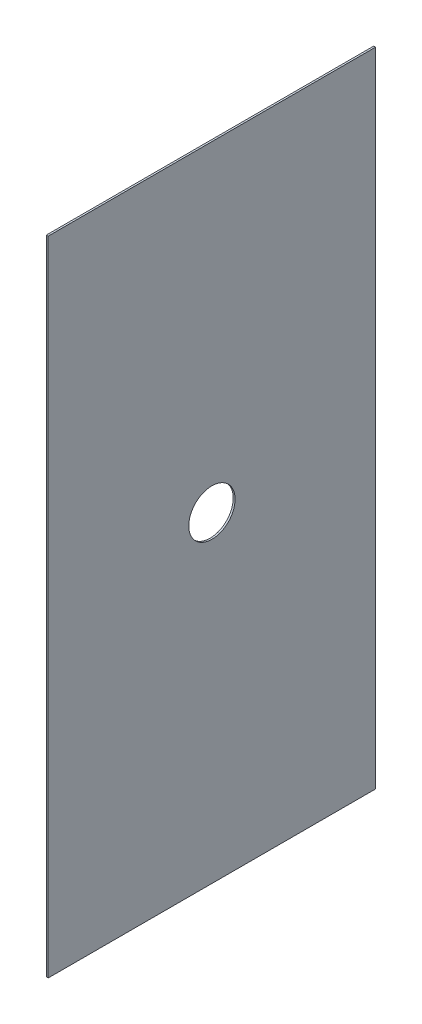
ISO-10303-21;
HEADER;
FILE_DESCRIPTION(('STEP AP214'),'2;1');
FILE_NAME('part.step','',(''),(''),'','','');
FILE_SCHEMA(('AUTOMOTIVE_DESIGN { 1 0 10303 214 1 1 1 1 }'));
ENDSEC;
DATA;
#1=APPLICATION_CONTEXT('core data for automotive mechanical design processes');
#2=APPLICATION_PROTOCOL_DEFINITION('international standard','automotive_design',2000,#1);
#3=PRODUCT_CONTEXT('',#1,'mechanical');
#4=PRODUCT('Part','Part','',(#3));
#5=PRODUCT_RELATED_PRODUCT_CATEGORY('part','',(#4));
#6=PRODUCT_DEFINITION_FORMATION('','',#4);
#7=PRODUCT_DEFINITION_CONTEXT('part definition',#1,'design');
#8=PRODUCT_DEFINITION('design','',#6,#7);
#9=PRODUCT_DEFINITION_SHAPE('','',#8);
#10=(LENGTH_UNIT() NAMED_UNIT(*) SI_UNIT(.MILLI.,.METRE.));
#11=(NAMED_UNIT(*) PLANE_ANGLE_UNIT() SI_UNIT($,.RADIAN.));
#12=(NAMED_UNIT(*) SI_UNIT($,.STERADIAN.) SOLID_ANGLE_UNIT());
#13=UNCERTAINTY_MEASURE_WITH_UNIT(LENGTH_MEASURE(1.E-05),#10,'distance_accuracy_value','');
#14=(GEOMETRIC_REPRESENTATION_CONTEXT(3) GLOBAL_UNCERTAINTY_ASSIGNED_CONTEXT((#13)) GLOBAL_UNIT_ASSIGNED_CONTEXT((#10,
#11,#12)) REPRESENTATION_CONTEXT('',''));
#15=CARTESIAN_POINT('',(0.,0.,0.));
#16=DIRECTION('',(0.,0.,1.));
#17=DIRECTION('',(1.,0.,0.));
#18=AXIS2_PLACEMENT_3D('',#15,#16,#17);
#19=CARTESIAN_POINT('',(3.,520.,265.));
#20=DIRECTION('',(0.,-1.,0.));
#21=DIRECTION('',(0.,0.,-1.));
#22=AXIS2_PLACEMENT_3D('',#19,#20,#21);
#23=PLANE('',#22);
#24=DIRECTION('',(0.,0.,1.));
#25=VECTOR('',#24,1.);
#26=CARTESIAN_POINT('',(0.,520.,265.));
#27=LINE('',#26,#25);
#28=CARTESIAN_POINT('',(0.,520.,-265.));
#29=VERTEX_POINT('',#28);
#30=CARTESIAN_POINT('',(0.,520.,265.));
#31=VERTEX_POINT('',#30);
#32=EDGE_CURVE('E97',#29,#31,#27,.T.);
#33=ORIENTED_EDGE('',*,*,#32,.T.);
#34=DIRECTION('',(-1.,0.,0.));
#35=VECTOR('',#34,1.);
#36=CARTESIAN_POINT('',(3.,520.,265.));
#37=LINE('',#36,#35);
#38=CARTESIAN_POINT('',(3.,520.,265.));
#39=VERTEX_POINT('',#38);
#40=EDGE_CURVE('E11',#39,#31,#37,.T.);
#41=ORIENTED_EDGE('',*,*,#40,.F.);
#42=DIRECTION('',(0.,0.,1.));
#43=VECTOR('',#42,1.);
#44=CARTESIAN_POINT('',(3.,520.,265.));
#45=LINE('',#44,#43);
#46=CARTESIAN_POINT('',(3.,520.,-265.));
#47=VERTEX_POINT('',#46);
#48=EDGE_CURVE('E85',#47,#39,#45,.T.);
#49=ORIENTED_EDGE('',*,*,#48,.F.);
#50=DIRECTION('',(-1.,0.,0.));
#51=VECTOR('',#50,1.);
#52=CARTESIAN_POINT('',(3.,520.,-265.));
#53=LINE('',#52,#51);
#54=EDGE_CURVE('E93',#47,#29,#53,.T.);
#55=ORIENTED_EDGE('',*,*,#54,.T.);
#56=EDGE_LOOP('',(#33,#41,#49,#55));
#57=FACE_BOUND('',#56,.T.);
#58=ADVANCED_FACE('F34',(#57),#23,.F.);
#59=CARTESIAN_POINT('',(3.,-520.,265.));
#60=DIRECTION('',(0.,0.,-1.));
#61=DIRECTION('',(0.,1.,0.));
#62=AXIS2_PLACEMENT_3D('',#59,#60,#61);
#63=PLANE('',#62);
#64=DIRECTION('',(0.,-1.,0.));
#65=VECTOR('',#64,1.);
#66=CARTESIAN_POINT('',(0.,-520.,265.));
#67=LINE('',#66,#65);
#68=CARTESIAN_POINT('',(0.,-520.,265.));
#69=VERTEX_POINT('',#68);
#70=EDGE_CURVE('E89',#31,#69,#67,.T.);
#71=ORIENTED_EDGE('',*,*,#70,.T.);
#72=DIRECTION('',(-1.,0.,0.));
#73=VECTOR('',#72,1.);
#74=CARTESIAN_POINT('',(3.,-520.,265.));
#75=LINE('',#74,#73);
#76=CARTESIAN_POINT('',(3.,-520.,265.));
#77=VERTEX_POINT('',#76);
#78=EDGE_CURVE('E42',#77,#69,#75,.T.);
#79=ORIENTED_EDGE('',*,*,#78,.F.);
#80=DIRECTION('',(0.,-1.,0.));
#81=VECTOR('',#80,1.);
#82=CARTESIAN_POINT('',(3.,-520.,265.));
#83=LINE('',#82,#81);
#84=EDGE_CURVE('E80',#39,#77,#83,.T.);
#85=ORIENTED_EDGE('',*,*,#84,.F.);
#86=ORIENTED_EDGE('',*,*,#40,.T.);
#87=EDGE_LOOP('',(#71,#79,#85,#86));
#88=FACE_BOUND('',#87,.T.);
#89=ADVANCED_FACE('F88',(#88),#63,.F.);
#90=CARTESIAN_POINT('',(3.,-520.,265.));
#91=DIRECTION('',(0.,1.,0.));
#92=DIRECTION('',(0.,0.,1.));
#93=AXIS2_PLACEMENT_3D('',#90,#91,#92);
#94=PLANE('',#93);
#95=DIRECTION('',(0.,0.,-1.));
#96=VECTOR('',#95,1.);
#97=CARTESIAN_POINT('',(0.,-520.,265.));
#98=LINE('',#97,#96);
#99=CARTESIAN_POINT('',(0.,-520.,-265.));
#100=VERTEX_POINT('',#99);
#101=EDGE_CURVE('E67',#69,#100,#98,.T.);
#102=ORIENTED_EDGE('',*,*,#101,.T.);
#103=DIRECTION('',(-1.,0.,0.));
#104=VECTOR('',#103,1.);
#105=CARTESIAN_POINT('',(3.,-520.,-265.));
#106=LINE('',#105,#104);
#107=CARTESIAN_POINT('',(3.,-520.,-265.));
#108=VERTEX_POINT('',#107);
#109=EDGE_CURVE('E90',#108,#100,#106,.T.);
#110=ORIENTED_EDGE('',*,*,#109,.F.);
#111=DIRECTION('',(0.,0.,-1.));
#112=VECTOR('',#111,1.);
#113=CARTESIAN_POINT('',(3.,-520.,265.));
#114=LINE('',#113,#112);
#115=EDGE_CURVE('E83',#77,#108,#114,.T.);
#116=ORIENTED_EDGE('',*,*,#115,.F.);
#117=ORIENTED_EDGE('',*,*,#78,.T.);
#118=EDGE_LOOP('',(#102,#110,#116,#117));
#119=FACE_BOUND('',#118,.T.);
#120=ADVANCED_FACE('F91',(#119),#94,.F.);
#121=CARTESIAN_POINT('',(3.,-520.,-265.));
#122=DIRECTION('',(0.,0.,1.));
#123=DIRECTION('',(0.,-1.,0.));
#124=AXIS2_PLACEMENT_3D('',#121,#122,#123);
#125=PLANE('',#124);
#126=DIRECTION('',(0.,1.,0.));
#127=VECTOR('',#126,1.);
#128=CARTESIAN_POINT('',(0.,-520.,-265.));
#129=LINE('',#128,#127);
#130=EDGE_CURVE('E73',#100,#29,#129,.T.);
#131=ORIENTED_EDGE('',*,*,#130,.T.);
#132=ORIENTED_EDGE('',*,*,#54,.F.);
#133=DIRECTION('',(0.,1.,0.));
#134=VECTOR('',#133,1.);
#135=CARTESIAN_POINT('',(3.,-520.,-265.));
#136=LINE('',#135,#134);
#137=EDGE_CURVE('E50',#108,#47,#136,.T.);
#138=ORIENTED_EDGE('',*,*,#137,.F.);
#139=ORIENTED_EDGE('',*,*,#109,.T.);
#140=EDGE_LOOP('',(#131,#132,#138,#139));
#141=FACE_BOUND('',#140,.T.);
#142=ADVANCED_FACE('F105',(#141),#125,.F.);
#143=CARTESIAN_POINT('',(3.,520.,-265.));
#144=DIRECTION('',(1.,0.,0.));
#145=DIRECTION('',(0.,0.,-1.));
#146=AXIS2_PLACEMENT_3D('',#143,#144,#145);
#147=PLANE('',#146);
#148=CARTESIAN_POINT('',(3.,1.11022302462516E-13,0.));
#149=DIRECTION('',(1.,0.,0.));
#150=DIRECTION('',(0.,0.,-1.));
#151=AXIS2_PLACEMENT_3D('',#148,#149,#150);
#152=CIRCLE('',#151,37.5);
#153=CARTESIAN_POINT('',(3.,1.11022302462516E-13,-37.5));
#154=VERTEX_POINT('',#153);
#155=EDGE_CURVE('E111',#154,#154,#152,.T.);
#156=ORIENTED_EDGE('',*,*,#155,.F.);
#157=EDGE_LOOP('',(#156));
#158=FACE_BOUND('',#157,.T.);
#159=ORIENTED_EDGE('',*,*,#48,.T.);
#160=ORIENTED_EDGE('',*,*,#84,.T.);
#161=ORIENTED_EDGE('',*,*,#115,.T.);
#162=ORIENTED_EDGE('',*,*,#137,.T.);
#163=EDGE_LOOP('',(#159,#160,#161,#162));
#164=FACE_BOUND('',#163,.T.);
#165=ADVANCED_FACE('F81',(#158,#164),#147,.T.);
#166=CARTESIAN_POINT('',(0.,520.,-265.));
#167=DIRECTION('',(1.,0.,0.));
#168=DIRECTION('',(0.,0.,-1.));
#169=AXIS2_PLACEMENT_3D('',#166,#167,#168);
#170=PLANE('',#169);
#171=CARTESIAN_POINT('',(0.,1.11022302462516E-13,0.));
#172=DIRECTION('',(1.,0.,0.));
#173=DIRECTION('',(0.,0.,-1.));
#174=AXIS2_PLACEMENT_3D('',#171,#172,#173);
#175=CIRCLE('',#174,37.5);
#176=CARTESIAN_POINT('',(0.,1.11022302462516E-13,-37.5));
#177=VERTEX_POINT('',#176);
#178=EDGE_CURVE('E100',#177,#177,#175,.T.);
#179=ORIENTED_EDGE('',*,*,#178,.T.);
#180=EDGE_LOOP('',(#179));
#181=FACE_BOUND('',#180,.T.);
#182=ORIENTED_EDGE('',*,*,#32,.F.);
#183=ORIENTED_EDGE('',*,*,#130,.F.);
#184=ORIENTED_EDGE('',*,*,#101,.F.);
#185=ORIENTED_EDGE('',*,*,#70,.F.);
#186=EDGE_LOOP('',(#182,#183,#184,#185));
#187=FACE_BOUND('',#186,.T.);
#188=ADVANCED_FACE('F108',(#181,#187),#170,.F.);
#189=CARTESIAN_POINT('',(0.,1.11022302462516E-13,0.));
#190=DIRECTION('',(1.,0.,0.));
#191=DIRECTION('',(0.,0.,-1.));
#192=AXIS2_PLACEMENT_3D('',#189,#190,#191);
#193=CYLINDRICAL_SURFACE('',#192,37.5);
#194=ORIENTED_EDGE('',*,*,#178,.F.);
#195=EDGE_LOOP('',(#194));
#196=FACE_BOUND('',#195,.T.);
#197=ORIENTED_EDGE('',*,*,#155,.T.);
#198=EDGE_LOOP('',(#197));
#199=FACE_BOUND('',#198,.T.);
#200=ADVANCED_FACE('F118',(#196,#199),#193,.F.);
#201=CLOSED_SHELL('',(#58,#89,#120,#142,#165,#188,#200));
#202=MANIFOLD_SOLID_BREP('B2',#201);
#203=ADVANCED_BREP_SHAPE_REPRESENTATION('',(#18,#202),#14);
#204=SHAPE_DEFINITION_REPRESENTATION(#9,#203);
ENDSEC;
END-ISO-10303-21;
